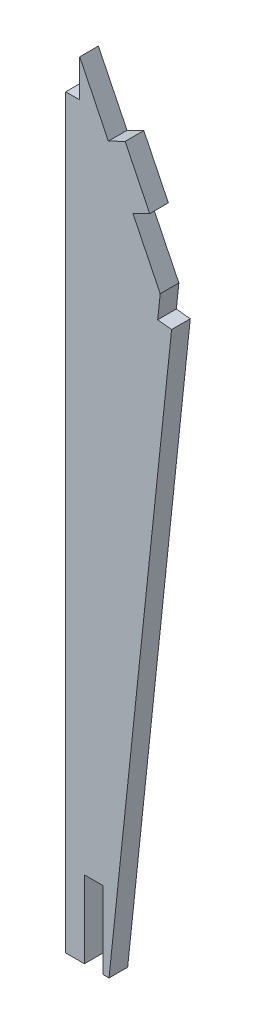
ISO-10303-21;
HEADER;
FILE_DESCRIPTION(('STEP AP214'),'2;1');
FILE_NAME('part.step','',(''),(''),'','','');
FILE_SCHEMA(('AUTOMOTIVE_DESIGN { 1 0 10303 214 1 1 1 1 }'));
ENDSEC;
DATA;
#1=APPLICATION_CONTEXT('core data for automotive mechanical design processes');
#2=APPLICATION_PROTOCOL_DEFINITION('international standard','automotive_design',2000,#1);
#3=PRODUCT_CONTEXT('',#1,'mechanical');
#4=PRODUCT('Part','Part','',(#3));
#5=PRODUCT_RELATED_PRODUCT_CATEGORY('part','',(#4));
#6=PRODUCT_DEFINITION_FORMATION('','',#4);
#7=PRODUCT_DEFINITION_CONTEXT('part definition',#1,'design');
#8=PRODUCT_DEFINITION('design','',#6,#7);
#9=PRODUCT_DEFINITION_SHAPE('','',#8);
#10=(LENGTH_UNIT() NAMED_UNIT(*) SI_UNIT(.MILLI.,.METRE.));
#11=(NAMED_UNIT(*) PLANE_ANGLE_UNIT() SI_UNIT($,.RADIAN.));
#12=(NAMED_UNIT(*) SI_UNIT($,.STERADIAN.) SOLID_ANGLE_UNIT());
#13=UNCERTAINTY_MEASURE_WITH_UNIT(LENGTH_MEASURE(1.E-05),#10,'distance_accuracy_value','');
#14=(GEOMETRIC_REPRESENTATION_CONTEXT(3) GLOBAL_UNCERTAINTY_ASSIGNED_CONTEXT((#13)) GLOBAL_UNIT_ASSIGNED_CONTEXT((#10,
#11,#12)) REPRESENTATION_CONTEXT('',''));
#15=CARTESIAN_POINT('',(0.,0.,0.));
#16=DIRECTION('',(0.,0.,1.));
#17=DIRECTION('',(1.,0.,0.));
#18=AXIS2_PLACEMENT_3D('',#15,#16,#17);
#19=CARTESIAN_POINT('',(7.39926029322988,70.0773337015109,2.));
#20=DIRECTION('',(0.10500336988203,0.994471866024081,0.));
#21=DIRECTION('',(-0.994471866024081,0.10500336988203,0.));
#22=AXIS2_PLACEMENT_3D('',#19,#20,#21);
#23=PLANE('',#22);
#24=DIRECTION('',(0.994471866024081,-0.10500336988203,0.));
#25=VECTOR('',#24,1.);
#26=CARTESIAN_POINT('',(7.39926029322988,70.0773337015109,0.));
#27=LINE('',#26,#25);
#28=CARTESIAN_POINT('',(16.7437470169898,69.0906767337924,0.));
#29=VERTEX_POINT('',#28);
#30=CARTESIAN_POINT('',(18.2354548160265,68.9331716789693,0.));
#31=VERTEX_POINT('',#30);
#32=EDGE_CURVE('E178',#29,#31,#27,.T.);
#33=ORIENTED_EDGE('',*,*,#32,.F.);
#34=DIRECTION('',(0.,0.,-1.));
#35=VECTOR('',#34,1.);
#36=CARTESIAN_POINT('',(16.7437470169898,69.0906767337924,2.));
#37=LINE('',#36,#35);
#38=CARTESIAN_POINT('',(16.7437470169898,69.0906767337924,2.));
#39=VERTEX_POINT('',#38);
#40=EDGE_CURVE('E11',#39,#29,#37,.T.);
#41=ORIENTED_EDGE('',*,*,#40,.F.);
#42=DIRECTION('',(0.994471866024081,-0.10500336988203,0.));
#43=VECTOR('',#42,1.);
#44=CARTESIAN_POINT('',(7.39926029322988,70.0773337015109,2.));
#45=LINE('',#44,#43);
#46=CARTESIAN_POINT('',(18.2354548160265,68.9331716789693,2.));
#47=VERTEX_POINT('',#46);
#48=EDGE_CURVE('E216',#39,#47,#45,.T.);
#49=ORIENTED_EDGE('',*,*,#48,.T.);
#50=DIRECTION('',(0.,0.,-1.));
#51=VECTOR('',#50,1.);
#52=CARTESIAN_POINT('',(18.2354548160265,68.9331716789693,2.));
#53=LINE('',#52,#51);
#54=EDGE_CURVE('E53',#47,#31,#53,.T.);
#55=ORIENTED_EDGE('',*,*,#54,.T.);
#56=EDGE_LOOP('',(#33,#41,#49,#55));
#57=FACE_BOUND('',#56,.T.);
#58=ADVANCED_FACE('F37',(#57),#23,.T.);
#59=CARTESIAN_POINT('',(9.34448672371561,-0.986656967719718,2.));
#60=DIRECTION('',(0.994471866024015,-0.10500336988265,0.));
#61=DIRECTION('',(0.10500336988265,0.994471866024015,0.));
#62=AXIS2_PLACEMENT_3D('',#59,#60,#61);
#63=PLANE('',#62);
#64=DIRECTION('',(-0.10500336988265,-0.994471866024015,0.));
#65=VECTOR('',#64,1.);
#66=CARTESIAN_POINT('',(9.34448672371561,-0.986656967719718,0.));
#67=LINE('',#66,#65);
#68=CARTESIAN_POINT('',(17.0127341164944,71.6382149992751,0.));
#69=VERTEX_POINT('',#68);
#70=EDGE_CURVE('E180',#69,#29,#67,.T.);
#71=ORIENTED_EDGE('',*,*,#70,.F.);
#72=DIRECTION('',(0.,0.,-1.));
#73=VECTOR('',#72,1.);
#74=CARTESIAN_POINT('',(17.0127341164944,71.6382149992751,2.));
#75=LINE('',#74,#73);
#76=CARTESIAN_POINT('',(17.0127341164944,71.6382149992751,2.));
#77=VERTEX_POINT('',#76);
#78=EDGE_CURVE('E45',#77,#69,#75,.T.);
#79=ORIENTED_EDGE('',*,*,#78,.F.);
#80=DIRECTION('',(-0.10500336988265,-0.994471866024015,0.));
#81=VECTOR('',#80,1.);
#82=CARTESIAN_POINT('',(9.34448672371561,-0.986656967719718,2.));
#83=LINE('',#82,#81);
#84=EDGE_CURVE('E266',#77,#39,#83,.T.);
#85=ORIENTED_EDGE('',*,*,#84,.T.);
#86=ORIENTED_EDGE('',*,*,#40,.T.);
#87=EDGE_LOOP('',(#71,#79,#85,#86));
#88=FACE_BOUND('',#87,.T.);
#89=ADVANCED_FACE('F254',(#88),#63,.T.);
#90=CARTESIAN_POINT('',(41.9692514453056,20.4697716476019,2.));
#91=DIRECTION('',(0.89879404629907,0.438371146789276,0.));
#92=DIRECTION('',(-0.438371146789276,0.89879404629907,0.));
#93=AXIS2_PLACEMENT_3D('',#90,#91,#92);
#94=PLANE('',#93);
#95=DIRECTION('',(0.438371146789276,-0.89879404629907,0.));
#96=VECTOR('',#95,1.);
#97=CARTESIAN_POINT('',(41.9692514453056,20.4697716476019,0.));
#98=LINE('',#97,#96);
#99=CARTESIAN_POINT('',(14.089587307546,77.6315541311587,0.));
#100=VERTEX_POINT('',#99);
#101=EDGE_CURVE('E183',#100,#69,#98,.T.);
#102=ORIENTED_EDGE('',*,*,#101,.F.);
#103=DIRECTION('',(0.,0.,-1.));
#104=VECTOR('',#103,1.);
#105=CARTESIAN_POINT('',(14.089587307546,77.6315541311587,2.));
#106=LINE('',#105,#104);
#107=CARTESIAN_POINT('',(14.089587307546,77.6315541311587,2.));
#108=VERTEX_POINT('',#107);
#109=EDGE_CURVE('E243',#108,#100,#106,.T.);
#110=ORIENTED_EDGE('',*,*,#109,.F.);
#111=DIRECTION('',(0.438371146789276,-0.89879404629907,0.));
#112=VECTOR('',#111,1.);
#113=CARTESIAN_POINT('',(41.9692514453056,20.4697716476019,2.));
#114=LINE('',#113,#112);
#115=EDGE_CURVE('E250',#108,#77,#114,.T.);
#116=ORIENTED_EDGE('',*,*,#115,.T.);
#117=ORIENTED_EDGE('',*,*,#78,.T.);
#118=EDGE_LOOP('',(#102,#110,#116,#117));
#119=FACE_BOUND('',#118,.T.);
#120=ADVANCED_FACE('F248',(#119),#94,.T.);
#121=CARTESIAN_POINT('',(-27.8796641377453,57.161782483584,2.));
#122=DIRECTION('',(0.438371146788926,-0.898794046299241,0.));
#123=DIRECTION('',(0.898794046299241,0.438371146788926,0.));
#124=AXIS2_PLACEMENT_3D('',#121,#122,#123);
#125=PLANE('',#124);
#126=DIRECTION('',(-0.898794046299241,-0.438371146788926,0.));
#127=VECTOR('',#126,1.);
#128=CARTESIAN_POINT('',(-27.8796641377453,57.161782483584,0.));
#129=LINE('',#128,#127);
#130=CARTESIAN_POINT('',(15.8871754001448,78.5082964247367,0.));
#131=VERTEX_POINT('',#130);
#132=EDGE_CURVE('E186',#131,#100,#129,.T.);
#133=ORIENTED_EDGE('',*,*,#132,.F.);
#134=DIRECTION('',(0.,0.,-1.));
#135=VECTOR('',#134,1.);
#136=CARTESIAN_POINT('',(15.8871754001448,78.5082964247367,2.));
#137=LINE('',#136,#135);
#138=CARTESIAN_POINT('',(15.8871754001448,78.5082964247367,2.));
#139=VERTEX_POINT('',#138);
#140=EDGE_CURVE('E241',#139,#131,#137,.T.);
#141=ORIENTED_EDGE('',*,*,#140,.F.);
#142=DIRECTION('',(-0.898794046299241,-0.438371146788926,0.));
#143=VECTOR('',#142,1.);
#144=CARTESIAN_POINT('',(-27.8796641377453,57.161782483584,2.));
#145=LINE('',#144,#143);
#146=EDGE_CURVE('E263',#139,#108,#145,.T.);
#147=ORIENTED_EDGE('',*,*,#146,.T.);
#148=ORIENTED_EDGE('',*,*,#109,.T.);
#149=EDGE_LOOP('',(#133,#141,#147,#148));
#150=FACE_BOUND('',#149,.T.);
#151=ADVANCED_FACE('F260',(#150),#125,.T.);
#152=CARTESIAN_POINT('',(43.7668395378975,21.3465139411675,2.));
#153=DIRECTION('',(0.89879404629915,0.438371146789113,0.));
#154=DIRECTION('',(-0.438371146789113,0.89879404629915,0.));
#155=AXIS2_PLACEMENT_3D('',#152,#153,#154);
#156=PLANE('',#155);
#157=DIRECTION('',(0.438371146789113,-0.89879404629915,0.));
#158=VECTOR('',#157,1.);
#159=CARTESIAN_POINT('',(43.7668395378975,21.3465139411675,0.));
#160=LINE('',#159,#158);
#161=CARTESIAN_POINT('',(13.2569485194099,83.9010607025321,0.));
#162=VERTEX_POINT('',#161);
#163=EDGE_CURVE('E189',#162,#131,#160,.T.);
#164=ORIENTED_EDGE('',*,*,#163,.F.);
#165=DIRECTION('',(0.,0.,-1.));
#166=VECTOR('',#165,1.);
#167=CARTESIAN_POINT('',(13.2569485194099,83.9010607025321,2.));
#168=LINE('',#167,#166);
#169=CARTESIAN_POINT('',(13.2569485194099,83.9010607025321,2.));
#170=VERTEX_POINT('',#169);
#171=EDGE_CURVE('E239',#170,#162,#168,.T.);
#172=ORIENTED_EDGE('',*,*,#171,.F.);
#173=DIRECTION('',(0.438371146789113,-0.89879404629915,0.));
#174=VECTOR('',#173,1.);
#175=CARTESIAN_POINT('',(43.7668395378975,21.3465139411675,2.));
#176=LINE('',#175,#174);
#177=EDGE_CURVE('E268',#170,#139,#176,.T.);
#178=ORIENTED_EDGE('',*,*,#177,.T.);
#179=ORIENTED_EDGE('',*,*,#140,.T.);
#180=EDGE_LOOP('',(#164,#172,#178,#179));
#181=FACE_BOUND('',#180,.T.);
#182=ADVANCED_FACE('F320',(#181),#156,.T.);
#183=CARTESIAN_POINT('',(-30.509891018479,62.5545467613799,2.));
#184=DIRECTION('',(-0.438371146788926,0.898794046299241,0.));
#185=DIRECTION('',(-0.898794046299241,-0.438371146788927,0.));
#186=AXIS2_PLACEMENT_3D('',#183,#184,#185);
#187=PLANE('',#186);
#188=DIRECTION('',(0.898794046299241,0.438371146788927,0.));
#189=VECTOR('',#188,1.);
#190=CARTESIAN_POINT('',(-30.509891018479,62.5545467613799,0.));
#191=LINE('',#190,#189);
#192=CARTESIAN_POINT('',(11.4593604268112,83.0243184089541,0.));
#193=VERTEX_POINT('',#192);
#194=EDGE_CURVE('E192',#193,#162,#191,.T.);
#195=ORIENTED_EDGE('',*,*,#194,.F.);
#196=DIRECTION('',(0.,0.,-1.));
#197=VECTOR('',#196,1.);
#198=CARTESIAN_POINT('',(11.4593604268112,83.0243184089541,2.));
#199=LINE('',#198,#197);
#200=CARTESIAN_POINT('',(11.4593604268112,83.0243184089541,2.));
#201=VERTEX_POINT('',#200);
#202=EDGE_CURVE('E237',#201,#193,#199,.T.);
#203=ORIENTED_EDGE('',*,*,#202,.F.);
#204=DIRECTION('',(0.898794046299241,0.438371146788927,0.));
#205=VECTOR('',#204,1.);
#206=CARTESIAN_POINT('',(-30.509891018479,62.5545467613799,2.));
#207=LINE('',#206,#205);
#208=EDGE_CURVE('E274',#201,#170,#207,.T.);
#209=ORIENTED_EDGE('',*,*,#208,.T.);
#210=ORIENTED_EDGE('',*,*,#171,.T.);
#211=EDGE_LOOP('',(#195,#203,#209,#210));
#212=FACE_BOUND('',#211,.T.);
#213=ADVANCED_FACE('F323',(#212),#187,.T.);
#214=CARTESIAN_POINT('',(41.9692514453002,20.4697716475914,2.));
#215=DIRECTION('',(0.898794046299136,0.438371146789141,0.));
#216=DIRECTION('',(-0.438371146789141,0.898794046299136,0.));
#217=AXIS2_PLACEMENT_3D('',#214,#215,#216);
#218=PLANE('',#217);
#219=DIRECTION('',(0.438371146789141,-0.898794046299136,0.));
#220=VECTOR('',#219,1.);
#221=CARTESIAN_POINT('',(41.9692514453002,20.4697716475914,0.));
#222=LINE('',#221,#220);
#223=CARTESIAN_POINT('',(8.39076239928636,89.3158767330497,0.));
#224=VERTEX_POINT('',#223);
#225=EDGE_CURVE('E195',#224,#193,#222,.T.);
#226=ORIENTED_EDGE('',*,*,#225,.F.);
#227=DIRECTION('',(0.,0.,-1.));
#228=VECTOR('',#227,1.);
#229=CARTESIAN_POINT('',(8.39076239928636,89.3158767330497,2.));
#230=LINE('',#229,#228);
#231=CARTESIAN_POINT('',(8.39076239928636,89.3158767330497,2.));
#232=VERTEX_POINT('',#231);
#233=EDGE_CURVE('E235',#232,#224,#230,.T.);
#234=ORIENTED_EDGE('',*,*,#233,.F.);
#235=DIRECTION('',(0.438371146789141,-0.898794046299136,0.));
#236=VECTOR('',#235,1.);
#237=CARTESIAN_POINT('',(41.9692514453002,20.4697716475914,2.));
#238=LINE('',#237,#236);
#239=EDGE_CURVE('E277',#232,#201,#238,.T.);
#240=ORIENTED_EDGE('',*,*,#239,.T.);
#241=ORIENTED_EDGE('',*,*,#202,.T.);
#242=EDGE_LOOP('',(#226,#234,#240,#241));
#243=FACE_BOUND('',#242,.T.);
#244=ADVANCED_FACE('F327',(#243),#218,.T.);
#245=CARTESIAN_POINT('',(8.39076239930669,1.9104293926492E-12,2.));
#246=DIRECTION('',(1.,2.27682456221982E-13,0.));
#247=DIRECTION('',(-2.27682456221982E-13,1.,0.));
#248=AXIS2_PLACEMENT_3D('',#245,#246,#247);
#249=PLANE('',#248);
#250=DIRECTION('',(2.27682456221982E-13,-1.,0.));
#251=VECTOR('',#250,1.);
#252=CARTESIAN_POINT('',(8.39076239930669,1.9104293926492E-12,0.));
#253=LINE('',#252,#251);
#254=CARTESIAN_POINT('',(8.39076239928727,85.3158767330501,0.));
#255=VERTEX_POINT('',#254);
#256=EDGE_CURVE('E198',#224,#255,#253,.T.);
#257=ORIENTED_EDGE('',*,*,#256,.T.);
#258=DIRECTION('',(0.,0.,-1.));
#259=VECTOR('',#258,1.);
#260=CARTESIAN_POINT('',(8.39076239928727,85.3158767330501,2.));
#261=LINE('',#260,#259);
#262=CARTESIAN_POINT('',(8.39076239928727,85.3158767330501,2.));
#263=VERTEX_POINT('',#262);
#264=EDGE_CURVE('E232',#263,#255,#261,.T.);
#265=ORIENTED_EDGE('',*,*,#264,.F.);
#266=DIRECTION('',(2.27682456221982E-13,-1.,0.));
#267=VECTOR('',#266,1.);
#268=CARTESIAN_POINT('',(8.39076239930669,1.9104293926492E-12,2.));
#269=LINE('',#268,#267);
#270=EDGE_CURVE('E280',#232,#263,#269,.T.);
#271=ORIENTED_EDGE('',*,*,#270,.F.);
#272=ORIENTED_EDGE('',*,*,#233,.T.);
#273=EDGE_LOOP('',(#257,#265,#271,#272));
#274=FACE_BOUND('',#273,.T.);
#275=ADVANCED_FACE('F331',(#274),#249,.F.);
#276=CARTESIAN_POINT('',(0.,85.3158767330501,2.));
#277=DIRECTION('',(0.,-1.,0.));
#278=DIRECTION('',(0.,0.,-1.));
#279=AXIS2_PLACEMENT_3D('',#276,#277,#278);
#280=PLANE('',#279);
#281=DIRECTION('',(-1.,0.,0.));
#282=VECTOR('',#281,1.);
#283=CARTESIAN_POINT('',(0.,85.3158767330501,0.));
#284=LINE('',#283,#282);
#285=CARTESIAN_POINT('',(6.89076239928727,85.3158767330501,0.));
#286=VERTEX_POINT('',#285);
#287=EDGE_CURVE('E200',#255,#286,#284,.T.);
#288=ORIENTED_EDGE('',*,*,#287,.T.);
#289=DIRECTION('',(0.,0.,-1.));
#290=VECTOR('',#289,1.);
#291=CARTESIAN_POINT('',(6.89076239928727,85.3158767330501,2.));
#292=LINE('',#291,#290);
#293=CARTESIAN_POINT('',(6.89076239928727,85.3158767330501,2.));
#294=VERTEX_POINT('',#293);
#295=EDGE_CURVE('E229',#294,#286,#292,.T.);
#296=ORIENTED_EDGE('',*,*,#295,.F.);
#297=DIRECTION('',(-1.,0.,0.));
#298=VECTOR('',#297,1.);
#299=CARTESIAN_POINT('',(0.,85.3158767330501,2.));
#300=LINE('',#299,#298);
#301=EDGE_CURVE('E282',#263,#294,#300,.T.);
#302=ORIENTED_EDGE('',*,*,#301,.F.);
#303=ORIENTED_EDGE('',*,*,#264,.T.);
#304=EDGE_LOOP('',(#288,#296,#302,#303));
#305=FACE_BOUND('',#304,.T.);
#306=ADVANCED_FACE('F335',(#305),#280,.F.);
#307=CARTESIAN_POINT('',(6.8907623992863,0.,2.));
#308=DIRECTION('',(1.,0.,0.));
#309=DIRECTION('',(0.,1.,0.));
#310=AXIS2_PLACEMENT_3D('',#307,#308,#309);
#311=PLANE('',#310);
#312=DIRECTION('',(0.,-1.,0.));
#313=VECTOR('',#312,1.);
#314=CARTESIAN_POINT('',(6.8907623992863,0.,0.));
#315=LINE('',#314,#313);
#316=CARTESIAN_POINT('',(6.89076239928636,5.40789832772089,0.));
#317=VERTEX_POINT('',#316);
#318=EDGE_CURVE('E202',#286,#317,#315,.T.);
#319=ORIENTED_EDGE('',*,*,#318,.T.);
#320=DIRECTION('',(0.,0.,-1.));
#321=VECTOR('',#320,1.);
#322=CARTESIAN_POINT('',(6.89076239928636,5.40789832772089,2.));
#323=LINE('',#322,#321);
#324=CARTESIAN_POINT('',(6.89076239928636,5.40789832772089,2.));
#325=VERTEX_POINT('',#324);
#326=EDGE_CURVE('E226',#325,#317,#323,.T.);
#327=ORIENTED_EDGE('',*,*,#326,.F.);
#328=DIRECTION('',(0.,-1.,0.));
#329=VECTOR('',#328,1.);
#330=CARTESIAN_POINT('',(6.8907623992863,0.,2.));
#331=LINE('',#330,#329);
#332=EDGE_CURVE('E284',#294,#325,#331,.T.);
#333=ORIENTED_EDGE('',*,*,#332,.F.);
#334=ORIENTED_EDGE('',*,*,#295,.T.);
#335=EDGE_LOOP('',(#319,#327,#333,#334));
#336=FACE_BOUND('',#335,.T.);
#337=ADVANCED_FACE('F339',(#336),#311,.F.);
#338=CARTESIAN_POINT('',(0.,5.40789832772089,2.));
#339=DIRECTION('',(0.,1.,0.));
#340=DIRECTION('',(0.,0.,1.));
#341=AXIS2_PLACEMENT_3D('',#338,#339,#340);
#342=PLANE('',#341);
#343=DIRECTION('',(1.,0.,0.));
#344=VECTOR('',#343,1.);
#345=CARTESIAN_POINT('',(0.,5.40789832772089,0.));
#346=LINE('',#345,#344);
#347=CARTESIAN_POINT('',(8.89076239928727,5.40789832772089,0.));
#348=VERTEX_POINT('',#347);
#349=EDGE_CURVE('E204',#317,#348,#346,.T.);
#350=ORIENTED_EDGE('',*,*,#349,.T.);
#351=DIRECTION('',(0.,0.,-1.));
#352=VECTOR('',#351,1.);
#353=CARTESIAN_POINT('',(8.89076239928727,5.40789832772089,2.));
#354=LINE('',#353,#352);
#355=CARTESIAN_POINT('',(8.89076239928727,5.40789832772089,2.));
#356=VERTEX_POINT('',#355);
#357=EDGE_CURVE('E223',#356,#348,#354,.T.);
#358=ORIENTED_EDGE('',*,*,#357,.F.);
#359=DIRECTION('',(1.,0.,0.));
#360=VECTOR('',#359,1.);
#361=CARTESIAN_POINT('',(0.,5.40789832772089,2.));
#362=LINE('',#361,#360);
#363=EDGE_CURVE('E286',#325,#356,#362,.T.);
#364=ORIENTED_EDGE('',*,*,#363,.F.);
#365=ORIENTED_EDGE('',*,*,#326,.T.);
#366=EDGE_LOOP('',(#350,#358,#364,#365));
#367=FACE_BOUND('',#366,.T.);
#368=ADVANCED_FACE('F343',(#367),#342,.F.);
#369=CARTESIAN_POINT('',(8.89076239928727,0.,2.));
#370=DIRECTION('',(-1.,0.,0.));
#371=DIRECTION('',(0.,0.,1.));
#372=AXIS2_PLACEMENT_3D('',#369,#370,#371);
#373=PLANE('',#372);
#374=DIRECTION('',(0.,1.,0.));
#375=VECTOR('',#374,1.);
#376=CARTESIAN_POINT('',(8.89076239928727,0.,0.));
#377=LINE('',#376,#375);
#378=CARTESIAN_POINT('',(8.89076239928727,13.6578983277318,0.));
#379=VERTEX_POINT('',#378);
#380=EDGE_CURVE('E206',#348,#379,#377,.T.);
#381=ORIENTED_EDGE('',*,*,#380,.T.);
#382=DIRECTION('',(0.,0.,-1.));
#383=VECTOR('',#382,1.);
#384=CARTESIAN_POINT('',(8.89076239928727,13.6578983277318,2.));
#385=LINE('',#384,#383);
#386=CARTESIAN_POINT('',(8.89076239928727,13.6578983277318,2.));
#387=VERTEX_POINT('',#386);
#388=EDGE_CURVE('E220',#387,#379,#385,.T.);
#389=ORIENTED_EDGE('',*,*,#388,.F.);
#390=DIRECTION('',(0.,1.,0.));
#391=VECTOR('',#390,1.);
#392=CARTESIAN_POINT('',(8.89076239928727,0.,2.));
#393=LINE('',#392,#391);
#394=EDGE_CURVE('E288',#356,#387,#393,.T.);
#395=ORIENTED_EDGE('',*,*,#394,.F.);
#396=ORIENTED_EDGE('',*,*,#357,.T.);
#397=EDGE_LOOP('',(#381,#389,#395,#396));
#398=FACE_BOUND('',#397,.T.);
#399=ADVANCED_FACE('F294',(#398),#373,.F.);
#400=CARTESIAN_POINT('',(0.,13.6578983277318,2.));
#401=DIRECTION('',(0.,1.,0.));
#402=DIRECTION('',(0.,0.,1.));
#403=AXIS2_PLACEMENT_3D('',#400,#401,#402);
#404=PLANE('',#403);
#405=DIRECTION('',(1.,0.,0.));
#406=VECTOR('',#405,1.);
#407=CARTESIAN_POINT('',(0.,13.6578983277318,0.));
#408=LINE('',#407,#406);
#409=CARTESIAN_POINT('',(10.8907623992873,13.6578983277318,0.));
#410=VERTEX_POINT('',#409);
#411=EDGE_CURVE('E208',#379,#410,#408,.T.);
#412=ORIENTED_EDGE('',*,*,#411,.T.);
#413=DIRECTION('',(0.,0.,-1.));
#414=VECTOR('',#413,1.);
#415=CARTESIAN_POINT('',(10.8907623992873,13.6578983277318,2.));
#416=LINE('',#415,#414);
#417=CARTESIAN_POINT('',(10.8907623992873,13.6578983277318,2.));
#418=VERTEX_POINT('',#417);
#419=EDGE_CURVE('E170',#418,#410,#416,.T.);
#420=ORIENTED_EDGE('',*,*,#419,.F.);
#421=DIRECTION('',(1.,0.,0.));
#422=VECTOR('',#421,1.);
#423=CARTESIAN_POINT('',(0.,13.6578983277318,2.));
#424=LINE('',#423,#422);
#425=EDGE_CURVE('E158',#387,#418,#424,.T.);
#426=ORIENTED_EDGE('',*,*,#425,.F.);
#427=ORIENTED_EDGE('',*,*,#388,.T.);
#428=EDGE_LOOP('',(#412,#420,#426,#427));
#429=FACE_BOUND('',#428,.T.);
#430=ADVANCED_FACE('F298',(#429),#404,.F.);
#431=CARTESIAN_POINT('',(10.8907623992873,0.,2.));
#432=DIRECTION('',(1.,0.,0.));
#433=DIRECTION('',(0.,0.,-1.));
#434=AXIS2_PLACEMENT_3D('',#431,#432,#433);
#435=PLANE('',#434);
#436=DIRECTION('',(0.,-1.,0.));
#437=VECTOR('',#436,1.);
#438=CARTESIAN_POINT('',(10.8907623992873,0.,0.));
#439=LINE('',#438,#437);
#440=CARTESIAN_POINT('',(10.8907623992873,5.40789832772043,0.));
#441=VERTEX_POINT('',#440);
#442=EDGE_CURVE('E167',#410,#441,#439,.T.);
#443=ORIENTED_EDGE('',*,*,#442,.T.);
#444=DIRECTION('',(0.,0.,-1.));
#445=VECTOR('',#444,1.);
#446=CARTESIAN_POINT('',(10.8907623992873,5.40789832772043,2.));
#447=LINE('',#446,#445);
#448=CARTESIAN_POINT('',(10.8907623992873,5.40789832772043,2.));
#449=VERTEX_POINT('',#448);
#450=EDGE_CURVE('E164',#449,#441,#447,.T.);
#451=ORIENTED_EDGE('',*,*,#450,.F.);
#452=DIRECTION('',(0.,-1.,0.));
#453=VECTOR('',#452,1.);
#454=CARTESIAN_POINT('',(10.8907623992873,0.,2.));
#455=LINE('',#454,#453);
#456=EDGE_CURVE('E151',#418,#449,#455,.T.);
#457=ORIENTED_EDGE('',*,*,#456,.F.);
#458=ORIENTED_EDGE('',*,*,#419,.T.);
#459=EDGE_LOOP('',(#443,#451,#457,#458));
#460=FACE_BOUND('',#459,.T.);
#461=ADVANCED_FACE('F165',(#460),#435,.F.);
#462=CARTESIAN_POINT('',(-3.85703558985839E-12,5.40789832771266,2.));
#463=DIRECTION('',(-7.13222652521607E-13,1.,0.));
#464=DIRECTION('',(-1.,-7.13222652521607E-13,0.));
#465=AXIS2_PLACEMENT_3D('',#462,#463,#464);
#466=PLANE('',#465);
#467=DIRECTION('',(1.,7.13222652521607E-13,0.));
#468=VECTOR('',#467,1.);
#469=CARTESIAN_POINT('',(-3.85703558985839E-12,5.40789832771266,0.));
#470=LINE('',#469,#468);
#471=CARTESIAN_POINT('',(11.5280073733484,5.40789832772089,0.));
#472=VERTEX_POINT('',#471);
#473=EDGE_CURVE('E211',#441,#472,#470,.T.);
#474=ORIENTED_EDGE('',*,*,#473,.T.);
#475=DIRECTION('',(0.,0.,-1.));
#476=VECTOR('',#475,1.);
#477=CARTESIAN_POINT('',(11.5280073733484,5.40789832772089,2.));
#478=LINE('',#477,#476);
#479=CARTESIAN_POINT('',(11.5280073733484,5.40789832772089,2.));
#480=VERTEX_POINT('',#479);
#481=EDGE_CURVE('E103',#480,#472,#478,.T.);
#482=ORIENTED_EDGE('',*,*,#481,.F.);
#483=DIRECTION('',(1.,7.13222652521607E-13,0.));
#484=VECTOR('',#483,1.);
#485=CARTESIAN_POINT('',(-3.85703558985839E-12,5.40789832771266,2.));
#486=LINE('',#485,#484);
#487=EDGE_CURVE('E156',#449,#480,#486,.T.);
#488=ORIENTED_EDGE('',*,*,#487,.F.);
#489=ORIENTED_EDGE('',*,*,#450,.T.);
#490=EDGE_LOOP('',(#474,#482,#488,#489));
#491=FACE_BOUND('',#490,.T.);
#492=ADVANCED_FACE('F172',(#491),#466,.F.);
#493=CARTESIAN_POINT('',(10.8361945227739,-1.14416202254271,2.));
#494=DIRECTION('',(0.994471866024048,-0.105003369882347,0.));
#495=DIRECTION('',(0.105003369882347,0.994471866024047,0.));
#496=AXIS2_PLACEMENT_3D('',#493,#494,#495);
#497=PLANE('',#496);
#498=DIRECTION('',(-0.105003369882347,-0.994471866024047,0.));
#499=VECTOR('',#498,1.);
#500=CARTESIAN_POINT('',(10.8361945227739,-1.14416202254271,0.));
#501=LINE('',#500,#499);
#502=EDGE_CURVE('E213',#31,#472,#501,.T.);
#503=ORIENTED_EDGE('',*,*,#502,.F.);
#504=ORIENTED_EDGE('',*,*,#54,.F.);
#505=DIRECTION('',(-0.105003369882347,-0.994471866024047,0.));
#506=VECTOR('',#505,1.);
#507=CARTESIAN_POINT('',(10.8361945227739,-1.14416202254271,2.));
#508=LINE('',#507,#506);
#509=EDGE_CURVE('E173',#47,#480,#508,.T.);
#510=ORIENTED_EDGE('',*,*,#509,.T.);
#511=ORIENTED_EDGE('',*,*,#481,.T.);
#512=EDGE_LOOP('',(#503,#504,#510,#511));
#513=FACE_BOUND('',#512,.T.);
#514=ADVANCED_FACE('F299',(#513),#497,.T.);
#515=CARTESIAN_POINT('',(0.,0.,2.));
#516=DIRECTION('',(0.,0.,1.));
#517=DIRECTION('',(1.,0.,0.));
#518=AXIS2_PLACEMENT_3D('',#515,#516,#517);
#519=PLANE('',#518);
#520=ORIENTED_EDGE('',*,*,#48,.F.);
#521=ORIENTED_EDGE('',*,*,#84,.F.);
#522=ORIENTED_EDGE('',*,*,#115,.F.);
#523=ORIENTED_EDGE('',*,*,#146,.F.);
#524=ORIENTED_EDGE('',*,*,#177,.F.);
#525=ORIENTED_EDGE('',*,*,#208,.F.);
#526=ORIENTED_EDGE('',*,*,#239,.F.);
#527=ORIENTED_EDGE('',*,*,#270,.T.);
#528=ORIENTED_EDGE('',*,*,#301,.T.);
#529=ORIENTED_EDGE('',*,*,#332,.T.);
#530=ORIENTED_EDGE('',*,*,#363,.T.);
#531=ORIENTED_EDGE('',*,*,#394,.T.);
#532=ORIENTED_EDGE('',*,*,#425,.T.);
#533=ORIENTED_EDGE('',*,*,#456,.T.);
#534=ORIENTED_EDGE('',*,*,#487,.T.);
#535=ORIENTED_EDGE('',*,*,#509,.F.);
#536=EDGE_LOOP('',(#520,#521,#522,#523,#524,#525,#526,#527,#528,#529,#530,#531,#532,#533,#534,#535));
#537=FACE_BOUND('',#536,.T.);
#538=ADVANCED_FACE('F153',(#537),#519,.T.);
#539=CARTESIAN_POINT('',(0.,0.,0.));
#540=DIRECTION('',(0.,0.,1.));
#541=DIRECTION('',(1.,0.,0.));
#542=AXIS2_PLACEMENT_3D('',#539,#540,#541);
#543=PLANE('',#542);
#544=ORIENTED_EDGE('',*,*,#32,.T.);
#545=ORIENTED_EDGE('',*,*,#502,.T.);
#546=ORIENTED_EDGE('',*,*,#473,.F.);
#547=ORIENTED_EDGE('',*,*,#442,.F.);
#548=ORIENTED_EDGE('',*,*,#411,.F.);
#549=ORIENTED_EDGE('',*,*,#380,.F.);
#550=ORIENTED_EDGE('',*,*,#349,.F.);
#551=ORIENTED_EDGE('',*,*,#318,.F.);
#552=ORIENTED_EDGE('',*,*,#287,.F.);
#553=ORIENTED_EDGE('',*,*,#256,.F.);
#554=ORIENTED_EDGE('',*,*,#225,.T.);
#555=ORIENTED_EDGE('',*,*,#194,.T.);
#556=ORIENTED_EDGE('',*,*,#163,.T.);
#557=ORIENTED_EDGE('',*,*,#132,.T.);
#558=ORIENTED_EDGE('',*,*,#101,.T.);
#559=ORIENTED_EDGE('',*,*,#70,.T.);
#560=EDGE_LOOP('',(#544,#545,#546,#547,#548,#549,#550,#551,#552,#553,#554,#555,#556,#557,#558,#559));
#561=FACE_BOUND('',#560,.T.);
#562=ADVANCED_FACE('F256',(#561),#543,.F.);
#563=CLOSED_SHELL('',(#58,#89,#120,#151,#182,#213,#244,#275,#306,#337,#368,#399,#430,#461,#492,
#514,#538,#562));
#564=MANIFOLD_SOLID_BREP('B2',#563);
#565=ADVANCED_BREP_SHAPE_REPRESENTATION('',(#18,#564),#14);
#566=SHAPE_DEFINITION_REPRESENTATION(#9,#565);
ENDSEC;
END-ISO-10303-21;
